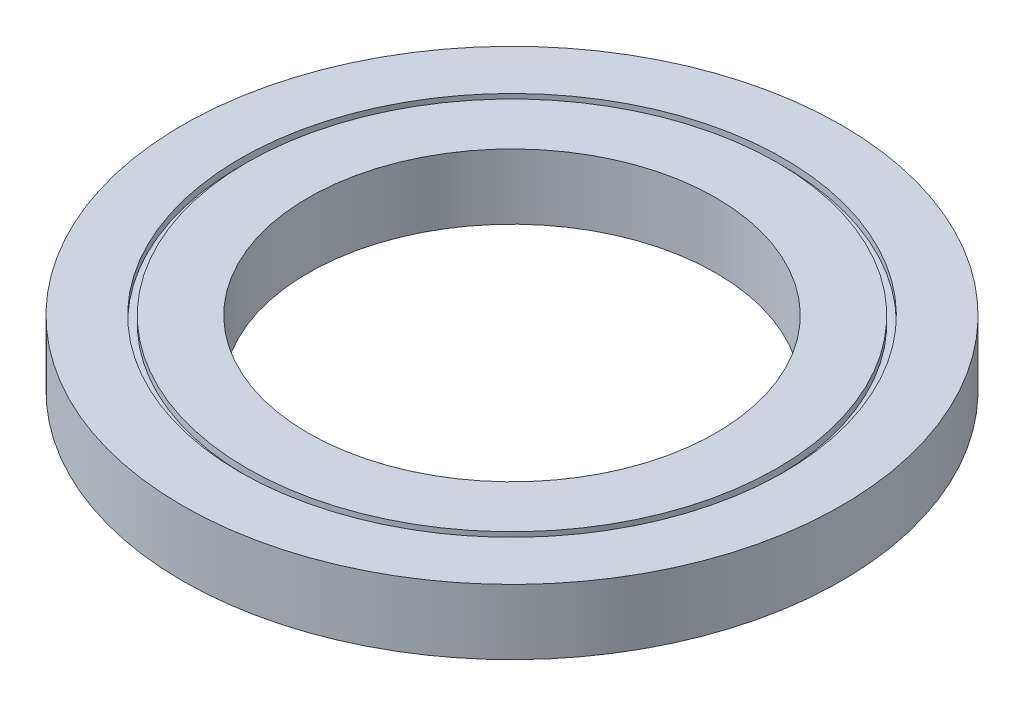
ISO-10303-21;
HEADER;
FILE_DESCRIPTION(('STEP AP214'),'2;1');
FILE_NAME('part.step','',(''),(''),'','','');
FILE_SCHEMA(('AUTOMOTIVE_DESIGN { 1 0 10303 214 1 1 1 1 }'));
ENDSEC;
DATA;
#1=APPLICATION_CONTEXT('core data for automotive mechanical design processes');
#2=APPLICATION_PROTOCOL_DEFINITION('international standard','automotive_design',2000,#1);
#3=PRODUCT_CONTEXT('',#1,'mechanical');
#4=PRODUCT('Part','Part','',(#3));
#5=PRODUCT_RELATED_PRODUCT_CATEGORY('part','',(#4));
#6=PRODUCT_DEFINITION_FORMATION('','',#4);
#7=PRODUCT_DEFINITION_CONTEXT('part definition',#1,'design');
#8=PRODUCT_DEFINITION('design','',#6,#7);
#9=PRODUCT_DEFINITION_SHAPE('','',#8);
#10=(LENGTH_UNIT() NAMED_UNIT(*) SI_UNIT(.MILLI.,.METRE.));
#11=(NAMED_UNIT(*) PLANE_ANGLE_UNIT() SI_UNIT($,.RADIAN.));
#12=(NAMED_UNIT(*) SI_UNIT($,.STERADIAN.) SOLID_ANGLE_UNIT());
#13=UNCERTAINTY_MEASURE_WITH_UNIT(LENGTH_MEASURE(1.E-05),#10,'distance_accuracy_value','');
#14=(GEOMETRIC_REPRESENTATION_CONTEXT(3) GLOBAL_UNCERTAINTY_ASSIGNED_CONTEXT((#13)) GLOBAL_UNIT_ASSIGNED_CONTEXT((#10,
#11,#12)) REPRESENTATION_CONTEXT('',''));
#15=CARTESIAN_POINT('',(0.,0.,0.));
#16=DIRECTION('',(0.,0.,1.));
#17=DIRECTION('',(1.,0.,0.));
#18=AXIS2_PLACEMENT_3D('',#15,#16,#17);
#19=CARTESIAN_POINT('',(0.,9.59,0.));
#20=DIRECTION('',(0.,1.,0.));
#21=DIRECTION('',(0.,0.,1.));
#22=AXIS2_PLACEMENT_3D('',#19,#20,#21);
#23=PLANE('',#22);
#24=CARTESIAN_POINT('',(0.,9.59,0.));
#25=DIRECTION('',(0.,1.,0.));
#26=DIRECTION('',(0.,0.,1.));
#27=AXIS2_PLACEMENT_3D('',#24,#25,#26);
#28=CIRCLE('',#27,30.);
#29=CARTESIAN_POINT('',(0.,9.59,30.));
#30=VERTEX_POINT('',#29);
#31=EDGE_CURVE('E43',#30,#30,#28,.T.);
#32=ORIENTED_EDGE('',*,*,#31,.F.);
#33=EDGE_LOOP('',(#32));
#34=FACE_BOUND('',#33,.T.);
#35=CARTESIAN_POINT('',(0.,9.59,0.));
#36=DIRECTION('',(0.,1.,0.));
#37=DIRECTION('',(0.,0.,1.));
#38=AXIS2_PLACEMENT_3D('',#35,#36,#37);
#39=CIRCLE('',#38,39.);
#40=CARTESIAN_POINT('',(0.,9.59,39.));
#41=VERTEX_POINT('',#40);
#42=EDGE_CURVE('E69',#41,#41,#39,.T.);
#43=ORIENTED_EDGE('',*,*,#42,.T.);
#44=EDGE_LOOP('',(#43));
#45=FACE_BOUND('',#44,.T.);
#46=ADVANCED_FACE('F32',(#34,#45),#23,.T.);
#47=CARTESIAN_POINT('',(0.,0.,0.));
#48=DIRECTION('',(0.,1.,0.));
#49=DIRECTION('',(0.,0.,1.));
#50=AXIS2_PLACEMENT_3D('',#47,#48,#49);
#51=PLANE('',#50);
#52=CARTESIAN_POINT('',(0.,0.,0.));
#53=DIRECTION('',(0.,1.,0.));
#54=DIRECTION('',(0.,0.,1.));
#55=AXIS2_PLACEMENT_3D('',#52,#53,#54);
#56=CIRCLE('',#55,30.);
#57=CARTESIAN_POINT('',(0.,0.,30.));
#58=VERTEX_POINT('',#57);
#59=EDGE_CURVE('E45',#58,#58,#56,.T.);
#60=ORIENTED_EDGE('',*,*,#59,.T.);
#61=EDGE_LOOP('',(#60));
#62=FACE_BOUND('',#61,.T.);
#63=CARTESIAN_POINT('',(0.,0.,0.));
#64=DIRECTION('',(0.,1.,0.));
#65=DIRECTION('',(0.,0.,1.));
#66=AXIS2_PLACEMENT_3D('',#63,#64,#65);
#67=CIRCLE('',#66,39.);
#68=CARTESIAN_POINT('',(0.,0.,39.));
#69=VERTEX_POINT('',#68);
#70=EDGE_CURVE('E57',#69,#69,#67,.T.);
#71=ORIENTED_EDGE('',*,*,#70,.F.);
#72=EDGE_LOOP('',(#71));
#73=FACE_BOUND('',#72,.T.);
#74=ADVANCED_FACE('F94',(#62,#73),#51,.F.);
#75=CARTESIAN_POINT('',(0.,9.59,0.));
#76=DIRECTION('',(0.,1.,0.));
#77=DIRECTION('',(0.,0.,1.));
#78=AXIS2_PLACEMENT_3D('',#75,#76,#77);
#79=CIRCLE('',#78,40.);
#80=CARTESIAN_POINT('',(0.,9.59,40.));
#81=VERTEX_POINT('',#80);
#82=EDGE_CURVE('E63',#81,#81,#79,.T.);
#83=ORIENTED_EDGE('',*,*,#82,.F.);
#84=EDGE_LOOP('',(#83));
#85=FACE_BOUND('',#84,.T.);
#86=CARTESIAN_POINT('',(0.,9.59,0.));
#87=DIRECTION('',(0.,1.,0.));
#88=DIRECTION('',(0.,0.,1.));
#89=AXIS2_PLACEMENT_3D('',#86,#87,#88);
#90=CIRCLE('',#89,48.5);
#91=CARTESIAN_POINT('',(0.,9.59,48.5));
#92=VERTEX_POINT('',#91);
#93=EDGE_CURVE('E10',#92,#92,#90,.T.);
#94=ORIENTED_EDGE('',*,*,#93,.T.);
#95=EDGE_LOOP('',(#94));
#96=FACE_BOUND('',#95,.T.);
#97=ADVANCED_FACE('F91',(#85,#96),#23,.T.);
#98=CARTESIAN_POINT('',(0.,0.,0.));
#99=DIRECTION('',(0.,1.,0.));
#100=DIRECTION('',(0.,0.,1.));
#101=AXIS2_PLACEMENT_3D('',#98,#99,#100);
#102=CIRCLE('',#101,40.);
#103=CARTESIAN_POINT('',(0.,0.,40.));
#104=VERTEX_POINT('',#103);
#105=EDGE_CURVE('E51',#104,#104,#102,.T.);
#106=ORIENTED_EDGE('',*,*,#105,.T.);
#107=EDGE_LOOP('',(#106));
#108=FACE_BOUND('',#107,.T.);
#109=CARTESIAN_POINT('',(0.,0.,0.));
#110=DIRECTION('',(0.,1.,0.));
#111=DIRECTION('',(0.,0.,1.));
#112=AXIS2_PLACEMENT_3D('',#109,#110,#111);
#113=CIRCLE('',#112,48.5);
#114=CARTESIAN_POINT('',(0.,0.,48.5));
#115=VERTEX_POINT('',#114);
#116=EDGE_CURVE('E36',#115,#115,#113,.T.);
#117=ORIENTED_EDGE('',*,*,#116,.F.);
#118=EDGE_LOOP('',(#117));
#119=FACE_BOUND('',#118,.T.);
#120=ADVANCED_FACE('F93',(#108,#119),#51,.F.);
#121=CARTESIAN_POINT('',(0.,9.59,0.));
#122=DIRECTION('',(0.,-1.,0.));
#123=DIRECTION('',(0.,0.,-1.));
#124=AXIS2_PLACEMENT_3D('',#121,#122,#123);
#125=CYLINDRICAL_SURFACE('',#124,48.5);
#126=ORIENTED_EDGE('',*,*,#93,.F.);
#127=EDGE_LOOP('',(#126));
#128=FACE_BOUND('',#127,.T.);
#129=ORIENTED_EDGE('',*,*,#116,.T.);
#130=EDGE_LOOP('',(#129));
#131=FACE_BOUND('',#130,.T.);
#132=ADVANCED_FACE('F34',(#128,#131),#125,.T.);
#133=CARTESIAN_POINT('',(0.,9.59,0.));
#134=DIRECTION('',(0.,-1.,0.));
#135=DIRECTION('',(0.,0.,-1.));
#136=AXIS2_PLACEMENT_3D('',#133,#134,#135);
#137=CYLINDRICAL_SURFACE('',#136,30.);
#138=ORIENTED_EDGE('',*,*,#31,.T.);
#139=EDGE_LOOP('',(#138));
#140=FACE_BOUND('',#139,.T.);
#141=ORIENTED_EDGE('',*,*,#59,.F.);
#142=EDGE_LOOP('',(#141));
#143=FACE_BOUND('',#142,.T.);
#144=ADVANCED_FACE('F122',(#140,#143),#137,.F.);
#145=CARTESIAN_POINT('',(0.,1.,0.));
#146=DIRECTION('',(0.,1.,0.));
#147=DIRECTION('',(0.,0.,1.));
#148=AXIS2_PLACEMENT_3D('',#145,#146,#147);
#149=PLANE('',#148);
#150=CARTESIAN_POINT('',(0.,1.,0.));
#151=DIRECTION('',(0.,1.,0.));
#152=DIRECTION('',(0.,0.,1.));
#153=AXIS2_PLACEMENT_3D('',#150,#151,#152);
#154=CIRCLE('',#153,40.);
#155=CARTESIAN_POINT('',(0.,1.,40.));
#156=VERTEX_POINT('',#155);
#157=EDGE_CURVE('E48',#156,#156,#154,.T.);
#158=ORIENTED_EDGE('',*,*,#157,.F.);
#159=EDGE_LOOP('',(#158));
#160=FACE_BOUND('',#159,.T.);
#161=CARTESIAN_POINT('',(0.,1.,0.));
#162=DIRECTION('',(0.,1.,0.));
#163=DIRECTION('',(0.,0.,1.));
#164=AXIS2_PLACEMENT_3D('',#161,#162,#163);
#165=CIRCLE('',#164,39.);
#166=CARTESIAN_POINT('',(0.,1.,39.));
#167=VERTEX_POINT('',#166);
#168=EDGE_CURVE('E54',#167,#167,#165,.T.);
#169=ORIENTED_EDGE('',*,*,#168,.T.);
#170=EDGE_LOOP('',(#169));
#171=FACE_BOUND('',#170,.T.);
#172=ADVANCED_FACE('F119',(#160,#171),#149,.F.);
#173=CARTESIAN_POINT('',(0.,1.,0.));
#174=DIRECTION('',(0.,-1.,0.));
#175=DIRECTION('',(0.,0.,-1.));
#176=AXIS2_PLACEMENT_3D('',#173,#174,#175);
#177=CYLINDRICAL_SURFACE('',#176,40.);
#178=ORIENTED_EDGE('',*,*,#157,.T.);
#179=EDGE_LOOP('',(#178));
#180=FACE_BOUND('',#179,.T.);
#181=ORIENTED_EDGE('',*,*,#105,.F.);
#182=EDGE_LOOP('',(#181));
#183=FACE_BOUND('',#182,.T.);
#184=ADVANCED_FACE('F117',(#180,#183),#177,.F.);
#185=CARTESIAN_POINT('',(0.,1.,0.));
#186=DIRECTION('',(0.,-1.,0.));
#187=DIRECTION('',(0.,0.,-1.));
#188=AXIS2_PLACEMENT_3D('',#185,#186,#187);
#189=CYLINDRICAL_SURFACE('',#188,39.);
#190=ORIENTED_EDGE('',*,*,#168,.F.);
#191=EDGE_LOOP('',(#190));
#192=FACE_BOUND('',#191,.T.);
#193=ORIENTED_EDGE('',*,*,#70,.T.);
#194=EDGE_LOOP('',(#193));
#195=FACE_BOUND('',#194,.T.);
#196=ADVANCED_FACE('F87',(#192,#195),#189,.T.);
#197=CARTESIAN_POINT('',(0.,8.59,0.));
#198=DIRECTION('',(0.,1.,0.));
#199=DIRECTION('',(0.,0.,1.));
#200=AXIS2_PLACEMENT_3D('',#197,#198,#199);
#201=CYLINDRICAL_SURFACE('',#200,40.);
#202=CARTESIAN_POINT('',(0.,8.59,0.));
#203=DIRECTION('',(0.,1.,0.));
#204=DIRECTION('',(0.,0.,1.));
#205=AXIS2_PLACEMENT_3D('',#202,#203,#204);
#206=CIRCLE('',#205,40.);
#207=CARTESIAN_POINT('',(0.,8.59,40.));
#208=VERTEX_POINT('',#207);
#209=EDGE_CURVE('E60',#208,#208,#206,.T.);
#210=ORIENTED_EDGE('',*,*,#209,.F.);
#211=EDGE_LOOP('',(#210));
#212=FACE_BOUND('',#211,.T.);
#213=ORIENTED_EDGE('',*,*,#82,.T.);
#214=EDGE_LOOP('',(#213));
#215=FACE_BOUND('',#214,.T.);
#216=ADVANCED_FACE('F81',(#212,#215),#201,.F.);
#217=CARTESIAN_POINT('',(0.,8.59,0.));
#218=DIRECTION('',(0.,1.,0.));
#219=DIRECTION('',(0.,0.,1.));
#220=AXIS2_PLACEMENT_3D('',#217,#218,#219);
#221=PLANE('',#220);
#222=CARTESIAN_POINT('',(0.,8.59,0.));
#223=DIRECTION('',(0.,1.,0.));
#224=DIRECTION('',(0.,0.,1.));
#225=AXIS2_PLACEMENT_3D('',#222,#223,#224);
#226=CIRCLE('',#225,39.);
#227=CARTESIAN_POINT('',(0.,8.59,39.));
#228=VERTEX_POINT('',#227);
#229=EDGE_CURVE('E66',#228,#228,#226,.T.);
#230=ORIENTED_EDGE('',*,*,#229,.F.);
#231=EDGE_LOOP('',(#230));
#232=FACE_BOUND('',#231,.T.);
#233=ORIENTED_EDGE('',*,*,#209,.T.);
#234=EDGE_LOOP('',(#233));
#235=FACE_BOUND('',#234,.T.);
#236=ADVANCED_FACE('F78',(#232,#235),#221,.T.);
#237=CARTESIAN_POINT('',(0.,8.59,0.));
#238=DIRECTION('',(0.,1.,0.));
#239=DIRECTION('',(0.,0.,1.));
#240=AXIS2_PLACEMENT_3D('',#237,#238,#239);
#241=CYLINDRICAL_SURFACE('',#240,39.);
#242=ORIENTED_EDGE('',*,*,#229,.T.);
#243=EDGE_LOOP('',(#242));
#244=FACE_BOUND('',#243,.T.);
#245=ORIENTED_EDGE('',*,*,#42,.F.);
#246=EDGE_LOOP('',(#245));
#247=FACE_BOUND('',#246,.T.);
#248=ADVANCED_FACE('F75',(#244,#247),#241,.T.);
#249=CLOSED_SHELL('',(#46,#74,#97,#120,#132,#144,#172,#184,#196,#216,#236,#248));
#250=MANIFOLD_SOLID_BREP('B2',#249);
#251=ADVANCED_BREP_SHAPE_REPRESENTATION('',(#18,#250),#14);
#252=SHAPE_DEFINITION_REPRESENTATION(#9,#251);
ENDSEC;
END-ISO-10303-21;
